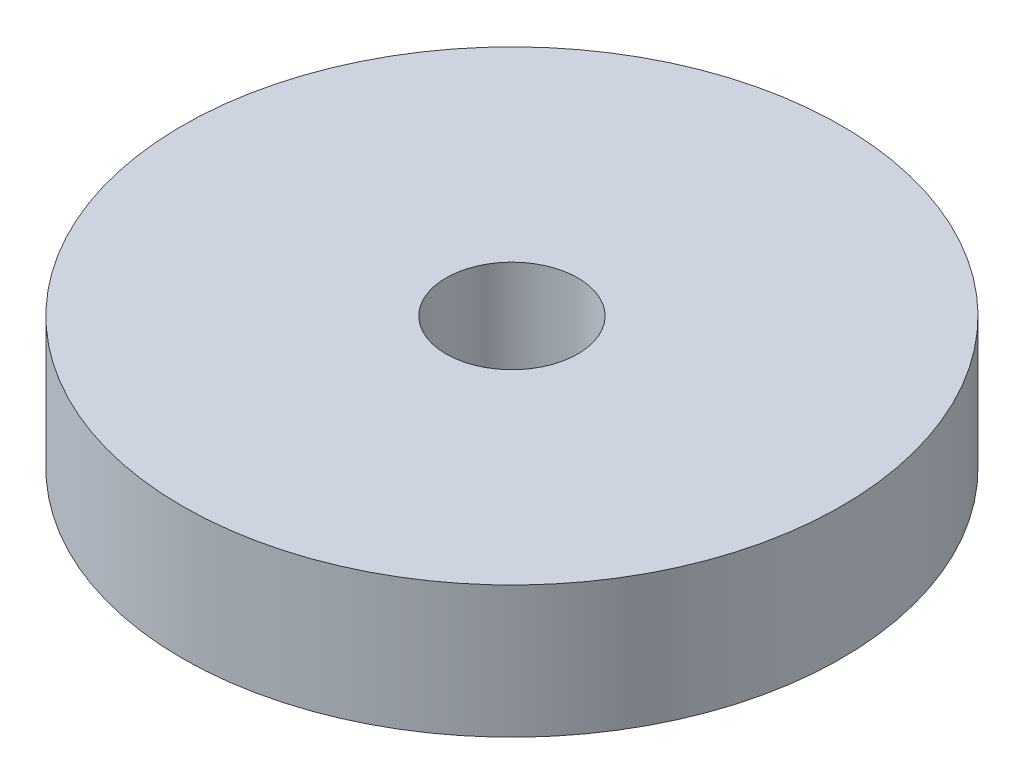
ISO-10303-21;
HEADER;
FILE_DESCRIPTION(('STEP AP214'),'2;1');
FILE_NAME('part.step','',(''),(''),'','','');
FILE_SCHEMA(('AUTOMOTIVE_DESIGN { 1 0 10303 214 1 1 1 1 }'));
ENDSEC;
DATA;
#1=APPLICATION_CONTEXT('core data for automotive mechanical design processes');
#2=APPLICATION_PROTOCOL_DEFINITION('international standard','automotive_design',2000,#1);
#3=PRODUCT_CONTEXT('',#1,'mechanical');
#4=PRODUCT('Part','Part','',(#3));
#5=PRODUCT_RELATED_PRODUCT_CATEGORY('part','',(#4));
#6=PRODUCT_DEFINITION_FORMATION('','',#4);
#7=PRODUCT_DEFINITION_CONTEXT('part definition',#1,'design');
#8=PRODUCT_DEFINITION('design','',#6,#7);
#9=PRODUCT_DEFINITION_SHAPE('','',#8);
#10=(LENGTH_UNIT() NAMED_UNIT(*) SI_UNIT(.MILLI.,.METRE.));
#11=(NAMED_UNIT(*) PLANE_ANGLE_UNIT() SI_UNIT($,.RADIAN.));
#12=(NAMED_UNIT(*) SI_UNIT($,.STERADIAN.) SOLID_ANGLE_UNIT());
#13=UNCERTAINTY_MEASURE_WITH_UNIT(LENGTH_MEASURE(1.E-05),#10,'distance_accuracy_value','');
#14=(GEOMETRIC_REPRESENTATION_CONTEXT(3) GLOBAL_UNCERTAINTY_ASSIGNED_CONTEXT((#13)) GLOBAL_UNIT_ASSIGNED_CONTEXT((#10,
#11,#12)) REPRESENTATION_CONTEXT('',''));
#15=CARTESIAN_POINT('',(0.,0.,0.));
#16=DIRECTION('',(0.,0.,1.));
#17=DIRECTION('',(1.,0.,0.));
#18=AXIS2_PLACEMENT_3D('',#15,#16,#17);
#19=CARTESIAN_POINT('',(0.,10.,0.));
#20=DIRECTION('',(0.,-1.,0.));
#21=DIRECTION('',(0.,0.,-1.));
#22=AXIS2_PLACEMENT_3D('',#19,#20,#21);
#23=CYLINDRICAL_SURFACE('',#22,25.);
#24=CARTESIAN_POINT('',(0.,10.,0.));
#25=DIRECTION('',(0.,1.,0.));
#26=DIRECTION('',(0.,0.,1.));
#27=AXIS2_PLACEMENT_3D('',#24,#25,#26);
#28=CIRCLE('',#27,25.);
#29=CARTESIAN_POINT('',(0.,10.,25.));
#30=VERTEX_POINT('',#29);
#31=EDGE_CURVE('E10',#30,#30,#28,.T.);
#32=ORIENTED_EDGE('',*,*,#31,.F.);
#33=EDGE_LOOP('',(#32));
#34=FACE_BOUND('',#33,.T.);
#35=CARTESIAN_POINT('',(0.,0.,0.));
#36=DIRECTION('',(0.,1.,0.));
#37=DIRECTION('',(0.,0.,1.));
#38=AXIS2_PLACEMENT_3D('',#35,#36,#37);
#39=CIRCLE('',#38,25.);
#40=CARTESIAN_POINT('',(0.,0.,25.));
#41=VERTEX_POINT('',#40);
#42=EDGE_CURVE('E34',#41,#41,#39,.T.);
#43=ORIENTED_EDGE('',*,*,#42,.T.);
#44=EDGE_LOOP('',(#43));
#45=FACE_BOUND('',#44,.T.);
#46=ADVANCED_FACE('F31',(#34,#45),#23,.T.);
#47=CARTESIAN_POINT('',(0.,10.,0.));
#48=DIRECTION('',(0.,1.,0.));
#49=DIRECTION('',(0.,0.,1.));
#50=AXIS2_PLACEMENT_3D('',#47,#48,#49);
#51=PLANE('',#50);
#52=CARTESIAN_POINT('',(0.,10.,0.));
#53=DIRECTION('',(0.,1.,0.));
#54=DIRECTION('',(0.,0.,1.));
#55=AXIS2_PLACEMENT_3D('',#52,#53,#54);
#56=CIRCLE('',#55,5.);
#57=CARTESIAN_POINT('',(0.,10.,5.));
#58=VERTEX_POINT('',#57);
#59=EDGE_CURVE('E43',#58,#58,#56,.T.);
#60=ORIENTED_EDGE('',*,*,#59,.F.);
#61=EDGE_LOOP('',(#60));
#62=FACE_BOUND('',#61,.T.);
#63=ORIENTED_EDGE('',*,*,#31,.T.);
#64=EDGE_LOOP('',(#63));
#65=FACE_BOUND('',#64,.T.);
#66=ADVANCED_FACE('F58',(#62,#65),#51,.T.);
#67=CARTESIAN_POINT('',(0.,0.,0.));
#68=DIRECTION('',(0.,1.,0.));
#69=DIRECTION('',(0.,0.,1.));
#70=AXIS2_PLACEMENT_3D('',#67,#68,#69);
#71=PLANE('',#70);
#72=CARTESIAN_POINT('',(0.,0.,0.));
#73=DIRECTION('',(0.,1.,0.));
#74=DIRECTION('',(0.,0.,1.));
#75=AXIS2_PLACEMENT_3D('',#72,#73,#74);
#76=CIRCLE('',#75,5.);
#77=CARTESIAN_POINT('',(0.,0.,5.));
#78=VERTEX_POINT('',#77);
#79=EDGE_CURVE('E41',#78,#78,#76,.T.);
#80=ORIENTED_EDGE('',*,*,#79,.T.);
#81=EDGE_LOOP('',(#80));
#82=FACE_BOUND('',#81,.T.);
#83=ORIENTED_EDGE('',*,*,#42,.F.);
#84=EDGE_LOOP('',(#83));
#85=FACE_BOUND('',#84,.T.);
#86=ADVANCED_FACE('F49',(#82,#85),#71,.F.);
#87=CARTESIAN_POINT('',(0.,0.,0.));
#88=DIRECTION('',(0.,1.,0.));
#89=DIRECTION('',(0.,0.,1.));
#90=AXIS2_PLACEMENT_3D('',#87,#88,#89);
#91=CYLINDRICAL_SURFACE('',#90,5.);
#92=ORIENTED_EDGE('',*,*,#79,.F.);
#93=EDGE_LOOP('',(#92));
#94=FACE_BOUND('',#93,.T.);
#95=ORIENTED_EDGE('',*,*,#59,.T.);
#96=EDGE_LOOP('',(#95));
#97=FACE_BOUND('',#96,.T.);
#98=ADVANCED_FACE('F52',(#94,#97),#91,.F.);
#99=CLOSED_SHELL('',(#46,#66,#86,#98));
#100=MANIFOLD_SOLID_BREP('B2',#99);
#101=ADVANCED_BREP_SHAPE_REPRESENTATION('',(#18,#100),#14);
#102=SHAPE_DEFINITION_REPRESENTATION(#9,#101);
ENDSEC;
END-ISO-10303-21;
